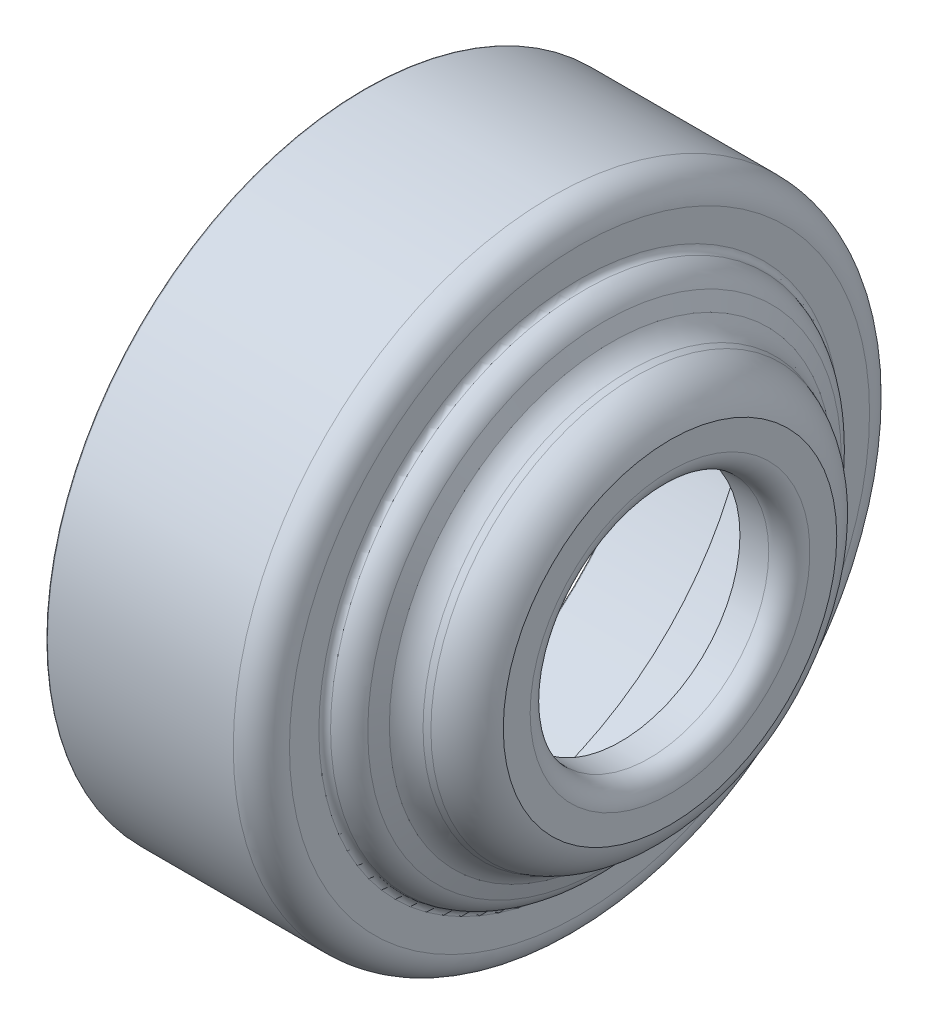
ISO-10303-21;
HEADER;
FILE_DESCRIPTION(('STEP AP214'),'2;1');
FILE_NAME('part.step','',(''),(''),'','','');
FILE_SCHEMA(('AUTOMOTIVE_DESIGN { 1 0 10303 214 1 1 1 1 }'));
ENDSEC;
DATA;
#1=APPLICATION_CONTEXT('core data for automotive mechanical design processes');
#2=APPLICATION_PROTOCOL_DEFINITION('international standard','automotive_design',2000,#1);
#3=PRODUCT_CONTEXT('',#1,'mechanical');
#4=PRODUCT('Part','Part','',(#3));
#5=PRODUCT_RELATED_PRODUCT_CATEGORY('part','',(#4));
#6=PRODUCT_DEFINITION_FORMATION('','',#4);
#7=PRODUCT_DEFINITION_CONTEXT('part definition',#1,'design');
#8=PRODUCT_DEFINITION('design','',#6,#7);
#9=PRODUCT_DEFINITION_SHAPE('','',#8);
#10=(LENGTH_UNIT() NAMED_UNIT(*) SI_UNIT(.MILLI.,.METRE.));
#11=(NAMED_UNIT(*) PLANE_ANGLE_UNIT() SI_UNIT($,.RADIAN.));
#12=(NAMED_UNIT(*) SI_UNIT($,.STERADIAN.) SOLID_ANGLE_UNIT());
#13=UNCERTAINTY_MEASURE_WITH_UNIT(LENGTH_MEASURE(1.E-05),#10,'distance_accuracy_value','');
#14=(GEOMETRIC_REPRESENTATION_CONTEXT(3) GLOBAL_UNCERTAINTY_ASSIGNED_CONTEXT((#13)) GLOBAL_UNIT_ASSIGNED_CONTEXT((#10,
#11,#12)) REPRESENTATION_CONTEXT('',''));
#15=CARTESIAN_POINT('',(0.,0.,0.));
#16=DIRECTION('',(0.,0.,1.));
#17=DIRECTION('',(1.,0.,0.));
#18=AXIS2_PLACEMENT_3D('',#15,#16,#17);
#19=CARTESIAN_POINT('',(-14.9,23.2,0.));
#20=DIRECTION('',(1.,0.,0.));
#21=DIRECTION('',(0.,0.,-1.));
#22=AXIS2_PLACEMENT_3D('',#19,#20,#21);
#23=PLANE('',#22);
#24=CARTESIAN_POINT('',(-14.9,0.,0.));
#25=DIRECTION('',(1.,0.,0.));
#26=DIRECTION('',(0.,0.,-1.));
#27=AXIS2_PLACEMENT_3D('',#24,#25,#26);
#28=CIRCLE('',#27,22.1);
#29=CARTESIAN_POINT('',(-14.9,0.,-22.1));
#30=VERTEX_POINT('',#29);
#31=EDGE_CURVE('E42',#30,#30,#28,.T.);
#32=ORIENTED_EDGE('',*,*,#31,.T.);
#33=EDGE_LOOP('',(#32));
#34=FACE_BOUND('',#33,.T.);
#35=CARTESIAN_POINT('',(-14.9,0.,0.));
#36=DIRECTION('',(1.,0.,0.));
#37=DIRECTION('',(0.,0.,-1.));
#38=AXIS2_PLACEMENT_3D('',#35,#36,#37);
#39=CIRCLE('',#38,23.1);
#40=CARTESIAN_POINT('',(-14.9,0.,-23.1));
#41=VERTEX_POINT('',#40);
#42=EDGE_CURVE('E46',#41,#41,#39,.F.);
#43=ORIENTED_EDGE('',*,*,#42,.T.);
#44=EDGE_LOOP('',(#43));
#45=FACE_BOUND('',#44,.T.);
#46=ADVANCED_FACE('F35',(#34,#45),#23,.F.);
#47=CARTESIAN_POINT('',(-28.9724854245721,0.,0.));
#48=DIRECTION('',(-1.,0.,0.));
#49=DIRECTION('',(0.,0.,1.));
#50=AXIS2_PLACEMENT_3D('',#47,#48,#49);
#51=CYLINDRICAL_SURFACE('',#50,22.);
#52=CARTESIAN_POINT('',(-14.8,0.,0.));
#53=DIRECTION('',(1.,0.,0.));
#54=DIRECTION('',(0.,0.,-1.));
#55=AXIS2_PLACEMENT_3D('',#52,#53,#54);
#56=CIRCLE('',#55,22.);
#57=CARTESIAN_POINT('',(-14.8,0.,-22.));
#58=VERTEX_POINT('',#57);
#59=EDGE_CURVE('E50',#58,#58,#56,.F.);
#60=ORIENTED_EDGE('',*,*,#59,.T.);
#61=EDGE_LOOP('',(#60));
#62=FACE_BOUND('',#61,.T.);
#63=CARTESIAN_POINT('',(-7.9,0.,0.));
#64=DIRECTION('',(-1.,0.,0.));
#65=DIRECTION('',(0.,0.,1.));
#66=AXIS2_PLACEMENT_3D('',#63,#64,#65);
#67=CIRCLE('',#66,22.);
#68=CARTESIAN_POINT('',(-7.9,0.,22.));
#69=VERTEX_POINT('',#68);
#70=EDGE_CURVE('E55',#69,#69,#67,.T.);
#71=ORIENTED_EDGE('',*,*,#70,.F.);
#72=EDGE_LOOP('',(#71));
#73=FACE_BOUND('',#72,.T.);
#74=ADVANCED_FACE('F292',(#62,#73),#51,.F.);
#75=CARTESIAN_POINT('',(-7.9,22.,0.));
#76=DIRECTION('',(1.,0.,0.));
#77=DIRECTION('',(0.,0.,-1.));
#78=AXIS2_PLACEMENT_3D('',#75,#76,#77);
#79=PLANE('',#78);
#80=CARTESIAN_POINT('',(-7.9,0.,0.));
#81=DIRECTION('',(-1.,0.,0.));
#82=DIRECTION('',(0.,0.,1.));
#83=AXIS2_PLACEMENT_3D('',#80,#81,#82);
#84=CIRCLE('',#83,21.4);
#85=CARTESIAN_POINT('',(-7.9,0.,21.4));
#86=VERTEX_POINT('',#85);
#87=EDGE_CURVE('E58',#86,#86,#84,.T.);
#88=ORIENTED_EDGE('',*,*,#87,.F.);
#89=EDGE_LOOP('',(#88));
#90=FACE_BOUND('',#89,.T.);
#91=ORIENTED_EDGE('',*,*,#70,.T.);
#92=EDGE_LOOP('',(#91));
#93=FACE_BOUND('',#92,.T.);
#94=ADVANCED_FACE('F286',(#90,#93),#79,.F.);
#95=CARTESIAN_POINT('',(-28.9724854245721,0.,0.));
#96=DIRECTION('',(-1.,0.,0.));
#97=DIRECTION('',(0.,0.,1.));
#98=AXIS2_PLACEMENT_3D('',#95,#96,#97);
#99=CYLINDRICAL_SURFACE('',#98,21.4);
#100=CARTESIAN_POINT('',(-0.899999999999998,0.,0.));
#101=DIRECTION('',(-1.,0.,0.));
#102=DIRECTION('',(0.,0.,1.));
#103=AXIS2_PLACEMENT_3D('',#100,#101,#102);
#104=CIRCLE('',#103,21.4);
#105=CARTESIAN_POINT('',(-0.899999999999998,0.,21.4));
#106=VERTEX_POINT('',#105);
#107=EDGE_CURVE('E61',#106,#106,#104,.T.);
#108=ORIENTED_EDGE('',*,*,#107,.F.);
#109=EDGE_LOOP('',(#108));
#110=FACE_BOUND('',#109,.T.);
#111=ORIENTED_EDGE('',*,*,#87,.T.);
#112=EDGE_LOOP('',(#111));
#113=FACE_BOUND('',#112,.T.);
#114=ADVANCED_FACE('F280',(#110,#113),#99,.F.);
#115=CARTESIAN_POINT('',(-0.899999999999997,0.,0.));
#116=DIRECTION('',(-1.,0.,0.));
#117=DIRECTION('',(0.,0.,1.));
#118=AXIS2_PLACEMENT_3D('',#115,#116,#117);
#119=TOROIDAL_SURFACE('',#118,20.9,0.499999999999998);
#120=CARTESIAN_POINT('',(-0.399999999999998,0.,0.));
#121=DIRECTION('',(-1.,0.,0.));
#122=DIRECTION('',(0.,0.,1.));
#123=AXIS2_PLACEMENT_3D('',#120,#121,#122);
#124=CIRCLE('',#123,20.9);
#125=CARTESIAN_POINT('',(-0.399999999999998,0.,20.9));
#126=VERTEX_POINT('',#125);
#127=EDGE_CURVE('E64',#126,#126,#124,.T.);
#128=ORIENTED_EDGE('',*,*,#127,.F.);
#129=EDGE_LOOP('',(#128));
#130=FACE_BOUND('',#129,.T.);
#131=ORIENTED_EDGE('',*,*,#107,.T.);
#132=EDGE_LOOP('',(#131));
#133=FACE_BOUND('',#132,.T.);
#134=ADVANCED_FACE('F274',(#130,#133),#119,.F.);
#135=CARTESIAN_POINT('',(-0.399999999999998,20.9,0.));
#136=DIRECTION('',(1.,0.,0.));
#137=DIRECTION('',(0.,0.,-1.));
#138=AXIS2_PLACEMENT_3D('',#135,#136,#137);
#139=PLANE('',#138);
#140=CARTESIAN_POINT('',(-0.399999999999998,0.,0.));
#141=DIRECTION('',(-1.,0.,0.));
#142=DIRECTION('',(0.,0.,1.));
#143=AXIS2_PLACEMENT_3D('',#140,#141,#142);
#144=CIRCLE('',#143,17.7);
#145=CARTESIAN_POINT('',(-0.399999999999998,0.,17.7));
#146=VERTEX_POINT('',#145);
#147=EDGE_CURVE('E67',#146,#146,#144,.T.);
#148=ORIENTED_EDGE('',*,*,#147,.F.);
#149=EDGE_LOOP('',(#148));
#150=FACE_BOUND('',#149,.T.);
#151=ORIENTED_EDGE('',*,*,#127,.T.);
#152=EDGE_LOOP('',(#151));
#153=FACE_BOUND('',#152,.T.);
#154=ADVANCED_FACE('F268',(#150,#153),#139,.F.);
#155=CARTESIAN_POINT('',(-0.0999999999999973,0.,0.));
#156=DIRECTION('',(-1.,0.,0.));
#157=DIRECTION('',(0.,0.,1.));
#158=AXIS2_PLACEMENT_3D('',#155,#156,#157);
#159=TOROIDAL_SURFACE('',#158,17.7,0.300000000000001);
#160=CARTESIAN_POINT('',(-0.0999999999999959,0.,0.));
#161=DIRECTION('',(-1.,0.,0.));
#162=DIRECTION('',(0.,0.,1.));
#163=AXIS2_PLACEMENT_3D('',#160,#161,#162);
#164=CIRCLE('',#163,17.4);
#165=CARTESIAN_POINT('',(-0.0999999999999959,0.,17.4));
#166=VERTEX_POINT('',#165);
#167=EDGE_CURVE('E70',#166,#166,#164,.T.);
#168=ORIENTED_EDGE('',*,*,#167,.F.);
#169=EDGE_LOOP('',(#168));
#170=FACE_BOUND('',#169,.T.);
#171=ORIENTED_EDGE('',*,*,#147,.T.);
#172=EDGE_LOOP('',(#171));
#173=FACE_BOUND('',#172,.T.);
#174=ADVANCED_FACE('F262',(#170,#173),#159,.T.);
#175=CARTESIAN_POINT('',(-28.9724854245721,0.,0.));
#176=DIRECTION('',(-1.,0.,0.));
#177=DIRECTION('',(0.,0.,1.));
#178=AXIS2_PLACEMENT_3D('',#175,#176,#177);
#179=CYLINDRICAL_SURFACE('',#178,17.4);
#180=CARTESIAN_POINT('',(0.600000000000003,0.,0.));
#181=DIRECTION('',(-1.,0.,0.));
#182=DIRECTION('',(0.,0.,1.));
#183=AXIS2_PLACEMENT_3D('',#180,#181,#182);
#184=CIRCLE('',#183,17.4);
#185=CARTESIAN_POINT('',(0.600000000000003,0.,17.4));
#186=VERTEX_POINT('',#185);
#187=EDGE_CURVE('E73',#186,#186,#184,.T.);
#188=ORIENTED_EDGE('',*,*,#187,.F.);
#189=EDGE_LOOP('',(#188));
#190=FACE_BOUND('',#189,.T.);
#191=ORIENTED_EDGE('',*,*,#167,.T.);
#192=EDGE_LOOP('',(#191));
#193=FACE_BOUND('',#192,.T.);
#194=ADVANCED_FACE('F256',(#190,#193),#179,.F.);
#195=CARTESIAN_POINT('',(0.601981361931688,0.,0.));
#196=DIRECTION('',(-1.,0.,0.));
#197=DIRECTION('',(0.,0.,1.));
#198=AXIS2_PLACEMENT_3D('',#195,#196,#197);
#199=TOROIDAL_SURFACE('',#198,16.4000019628995,1.);
#200=CARTESIAN_POINT('',(1.52069821576387,0.,0.));
#201=DIRECTION('',(-1.,0.,0.));
#202=DIRECTION('',(0.,0.,1.));
#203=AXIS2_PLACEMENT_3D('',#200,#201,#202);
#204=CIRCLE('',#203,16.7949188433752);
#205=CARTESIAN_POINT('',(1.52069821576387,0.,16.7949188433752));
#206=VERTEX_POINT('',#205);
#207=EDGE_CURVE('E76',#206,#206,#204,.T.);
#208=ORIENTED_EDGE('',*,*,#207,.F.);
#209=EDGE_LOOP('',(#208));
#210=FACE_BOUND('',#209,.T.);
#211=ORIENTED_EDGE('',*,*,#187,.T.);
#212=EDGE_LOOP('',(#211));
#213=FACE_BOUND('',#212,.T.);
#214=ADVANCED_FACE('F250',(#210,#213),#199,.F.);
#215=CARTESIAN_POINT('',(1.52069821576387,0.,0.));
#216=DIRECTION('',(-1.,0.,0.));
#217=DIRECTION('',(0.,0.,1.));
#218=AXIS2_PLACEMENT_3D('',#215,#216,#217);
#219=CONICAL_SURFACE('',#218,16.7949188433752,1.1693705988362);
#220=CARTESIAN_POINT('',(2.02193494607727,0.,0.));
#221=DIRECTION('',(-1.,0.,0.));
#222=DIRECTION('',(0.,0.,1.));
#223=AXIS2_PLACEMENT_3D('',#220,#221,#222);
#224=CIRCLE('',#223,15.6140791064286);
#225=CARTESIAN_POINT('',(2.02193494607727,0.,15.6140791064286));
#226=VERTEX_POINT('',#225);
#227=EDGE_CURVE('E79',#226,#226,#224,.T.);
#228=ORIENTED_EDGE('',*,*,#227,.F.);
#229=EDGE_LOOP('',(#228));
#230=FACE_BOUND('',#229,.T.);
#231=ORIENTED_EDGE('',*,*,#207,.T.);
#232=EDGE_LOOP('',(#231));
#233=FACE_BOUND('',#232,.T.);
#234=ADVANCED_FACE('F244',(#230,#233),#219,.F.);
#235=CARTESIAN_POINT('',(5.38571216961617,0.,0.));
#236=DIRECTION('',(-1.,0.,0.));
#237=DIRECTION('',(0.,0.,1.));
#238=AXIS2_PLACEMENT_3D('',#235,#236,#237);
#239=TOROIDAL_SURFACE('',#238,17.5808166444888,3.89654382154419);
#240=CARTESIAN_POINT('',(4.02426123459067,0.,0.));
#241=DIRECTION('',(-1.,0.,0.));
#242=DIRECTION('',(0.,0.,1.));
#243=AXIS2_PLACEMENT_3D('',#240,#241,#242);
#244=CIRCLE('',#243,13.92985716721);
#245=CARTESIAN_POINT('',(4.02426123459067,0.,13.92985716721));
#246=VERTEX_POINT('',#245);
#247=EDGE_CURVE('E82',#246,#246,#244,.T.);
#248=ORIENTED_EDGE('',*,*,#247,.F.);
#249=EDGE_LOOP('',(#248));
#250=FACE_BOUND('',#249,.T.);
#251=ORIENTED_EDGE('',*,*,#227,.T.);
#252=EDGE_LOOP('',(#251));
#253=FACE_BOUND('',#252,.T.);
#254=ADVANCED_FACE('F238',(#250,#253),#239,.T.);
#255=CARTESIAN_POINT('',(4.02426123459067,0.,0.));
#256=DIRECTION('',(-1.,0.,0.));
#257=DIRECTION('',(0.,0.,1.));
#258=AXIS2_PLACEMENT_3D('',#255,#256,#257);
#259=CONICAL_SURFACE('',#258,13.92985716721,0.356930263272574);
#260=CARTESIAN_POINT('',(4.46608341092177,0.,0.));
#261=DIRECTION('',(-1.,0.,0.));
#262=DIRECTION('',(0.,0.,1.));
#263=AXIS2_PLACEMENT_3D('',#260,#261,#262);
#264=CIRCLE('',#263,13.7651006918713);
#265=CARTESIAN_POINT('',(4.46608341092177,0.,13.7651006918713));
#266=VERTEX_POINT('',#265);
#267=EDGE_CURVE('E85',#266,#266,#264,.T.);
#268=ORIENTED_EDGE('',*,*,#267,.F.);
#269=EDGE_LOOP('',(#268));
#270=FACE_BOUND('',#269,.T.);
#271=ORIENTED_EDGE('',*,*,#247,.T.);
#272=EDGE_LOOP('',(#271));
#273=FACE_BOUND('',#272,.T.);
#274=ADVANCED_FACE('F232',(#270,#273),#259,.F.);
#275=CARTESIAN_POINT('',(3.65724851185547,0.,0.));
#276=DIRECTION('',(-1.,0.,0.));
#277=DIRECTION('',(0.,0.,1.));
#278=AXIS2_PLACEMENT_3D('',#275,#276,#277);
#279=TOROIDAL_SURFACE('',#278,11.2363634560668,2.6549436720374);
#280=CARTESIAN_POINT('',(6.2,0.,0.));
#281=DIRECTION('',(-1.,0.,0.));
#282=DIRECTION('',(0.,0.,1.));
#283=AXIS2_PLACEMENT_3D('',#280,#281,#282);
#284=CIRCLE('',#283,12.);
#285=CARTESIAN_POINT('',(6.2,0.,12.));
#286=VERTEX_POINT('',#285);
#287=EDGE_CURVE('E88',#286,#286,#284,.T.);
#288=ORIENTED_EDGE('',*,*,#287,.F.);
#289=EDGE_LOOP('',(#288));
#290=FACE_BOUND('',#289,.T.);
#291=ORIENTED_EDGE('',*,*,#267,.T.);
#292=EDGE_LOOP('',(#291));
#293=FACE_BOUND('',#292,.T.);
#294=ADVANCED_FACE('F226',(#290,#293),#279,.F.);
#295=CARTESIAN_POINT('',(6.2,12.,0.));
#296=DIRECTION('',(1.,0.,0.));
#297=DIRECTION('',(0.,0.,-1.));
#298=AXIS2_PLACEMENT_3D('',#295,#296,#297);
#299=PLANE('',#298);
#300=CARTESIAN_POINT('',(6.2,0.,0.));
#301=DIRECTION('',(-1.,0.,0.));
#302=DIRECTION('',(0.,0.,1.));
#303=AXIS2_PLACEMENT_3D('',#300,#301,#302);
#304=CIRCLE('',#303,9.89999999999999);
#305=CARTESIAN_POINT('',(6.2,0.,9.89999999999999));
#306=VERTEX_POINT('',#305);
#307=EDGE_CURVE('E91',#306,#306,#304,.T.);
#308=ORIENTED_EDGE('',*,*,#307,.F.);
#309=EDGE_LOOP('',(#308));
#310=FACE_BOUND('',#309,.T.);
#311=ORIENTED_EDGE('',*,*,#287,.T.);
#312=EDGE_LOOP('',(#311));
#313=FACE_BOUND('',#312,.T.);
#314=ADVANCED_FACE('F220',(#310,#313),#299,.F.);
#315=CARTESIAN_POINT('',(5.7,0.,0.));
#316=DIRECTION('',(-1.,0.,0.));
#317=DIRECTION('',(0.,0.,1.));
#318=AXIS2_PLACEMENT_3D('',#315,#316,#317);
#319=TOROIDAL_SURFACE('',#318,9.89999999999999,0.499999999999999);
#320=CARTESIAN_POINT('',(5.7,0.,0.));
#321=DIRECTION('',(-1.,0.,0.));
#322=DIRECTION('',(0.,0.,1.));
#323=AXIS2_PLACEMENT_3D('',#320,#321,#322);
#324=CIRCLE('',#323,9.39999999999999);
#325=CARTESIAN_POINT('',(5.7,0.,9.39999999999999));
#326=VERTEX_POINT('',#325);
#327=EDGE_CURVE('E94',#326,#326,#324,.T.);
#328=ORIENTED_EDGE('',*,*,#327,.F.);
#329=EDGE_LOOP('',(#328));
#330=FACE_BOUND('',#329,.T.);
#331=ORIENTED_EDGE('',*,*,#307,.T.);
#332=EDGE_LOOP('',(#331));
#333=FACE_BOUND('',#332,.T.);
#334=ADVANCED_FACE('F214',(#330,#333),#319,.F.);
#335=CARTESIAN_POINT('',(-28.9724854245721,0.,0.));
#336=DIRECTION('',(-1.,0.,0.));
#337=DIRECTION('',(0.,0.,1.));
#338=AXIS2_PLACEMENT_3D('',#335,#336,#337);
#339=CYLINDRICAL_SURFACE('',#338,9.39999999999999);
#340=CARTESIAN_POINT('',(3.8,0.,0.));
#341=DIRECTION('',(-1.,0.,0.));
#342=DIRECTION('',(0.,0.,1.));
#343=AXIS2_PLACEMENT_3D('',#340,#341,#342);
#344=CIRCLE('',#343,9.39999999999999);
#345=CARTESIAN_POINT('',(3.8,0.,9.39999999999999));
#346=VERTEX_POINT('',#345);
#347=EDGE_CURVE('E97',#346,#346,#344,.T.);
#348=ORIENTED_EDGE('',*,*,#347,.F.);
#349=EDGE_LOOP('',(#348));
#350=FACE_BOUND('',#349,.T.);
#351=ORIENTED_EDGE('',*,*,#327,.T.);
#352=EDGE_LOOP('',(#351));
#353=FACE_BOUND('',#352,.T.);
#354=ADVANCED_FACE('F208',(#350,#353),#339,.T.);
#355=CARTESIAN_POINT('',(3.8,9.39999999999999,0.));
#356=DIRECTION('',(1.,0.,0.));
#357=DIRECTION('',(0.,0.,-1.));
#358=AXIS2_PLACEMENT_3D('',#355,#356,#357);
#359=PLANE('',#358);
#360=CARTESIAN_POINT('',(3.8,0.,0.));
#361=DIRECTION('',(-1.,0.,0.));
#362=DIRECTION('',(0.,0.,1.));
#363=AXIS2_PLACEMENT_3D('',#360,#361,#362);
#364=CIRCLE('',#363,8.69999999999999);
#365=CARTESIAN_POINT('',(3.8,0.,8.69999999999999));
#366=VERTEX_POINT('',#365);
#367=EDGE_CURVE('E100',#366,#366,#364,.T.);
#368=ORIENTED_EDGE('',*,*,#367,.F.);
#369=EDGE_LOOP('',(#368));
#370=FACE_BOUND('',#369,.T.);
#371=ORIENTED_EDGE('',*,*,#347,.T.);
#372=EDGE_LOOP('',(#371));
#373=FACE_BOUND('',#372,.T.);
#374=ADVANCED_FACE('F202',(#370,#373),#359,.F.);
#375=CARTESIAN_POINT('',(-28.9724854245721,0.,0.));
#376=DIRECTION('',(-1.,0.,0.));
#377=DIRECTION('',(0.,0.,1.));
#378=AXIS2_PLACEMENT_3D('',#375,#376,#377);
#379=CYLINDRICAL_SURFACE('',#378,8.69999999999999);
#380=CARTESIAN_POINT('',(5.9,0.,0.));
#381=DIRECTION('',(-1.,0.,0.));
#382=DIRECTION('',(0.,0.,1.));
#383=AXIS2_PLACEMENT_3D('',#380,#381,#382);
#384=CIRCLE('',#383,8.69999999999999);
#385=CARTESIAN_POINT('',(5.9,0.,8.69999999999999));
#386=VERTEX_POINT('',#385);
#387=EDGE_CURVE('E103',#386,#386,#384,.T.);
#388=ORIENTED_EDGE('',*,*,#387,.F.);
#389=EDGE_LOOP('',(#388));
#390=FACE_BOUND('',#389,.T.);
#391=ORIENTED_EDGE('',*,*,#367,.T.);
#392=EDGE_LOOP('',(#391));
#393=FACE_BOUND('',#392,.T.);
#394=ADVANCED_FACE('F196',(#390,#393),#379,.F.);
#395=CARTESIAN_POINT('',(5.9,0.,0.));
#396=DIRECTION('',(-1.,0.,0.));
#397=DIRECTION('',(0.,0.,1.));
#398=AXIS2_PLACEMENT_3D('',#395,#396,#397);
#399=TOROIDAL_SURFACE('',#398,10.2,1.5);
#400=CARTESIAN_POINT('',(7.4,0.,0.));
#401=DIRECTION('',(-1.,0.,0.));
#402=DIRECTION('',(0.,0.,1.));
#403=AXIS2_PLACEMENT_3D('',#400,#401,#402);
#404=CIRCLE('',#403,10.2);
#405=CARTESIAN_POINT('',(7.4,0.,10.2));
#406=VERTEX_POINT('',#405);
#407=EDGE_CURVE('E106',#406,#406,#404,.T.);
#408=ORIENTED_EDGE('',*,*,#407,.F.);
#409=EDGE_LOOP('',(#408));
#410=FACE_BOUND('',#409,.T.);
#411=ORIENTED_EDGE('',*,*,#387,.T.);
#412=EDGE_LOOP('',(#411));
#413=FACE_BOUND('',#412,.T.);
#414=ADVANCED_FACE('F190',(#410,#413),#399,.T.);
#415=CARTESIAN_POINT('',(7.4,12.1596196570062,0.));
#416=DIRECTION('',(-1.,0.,0.));
#417=DIRECTION('',(0.,0.,1.));
#418=AXIS2_PLACEMENT_3D('',#415,#416,#417);
#419=PLANE('',#418);
#420=CARTESIAN_POINT('',(7.4,0.,0.));
#421=DIRECTION('',(-1.,0.,0.));
#422=DIRECTION('',(0.,0.,1.));
#423=AXIS2_PLACEMENT_3D('',#420,#421,#422);
#424=CIRCLE('',#423,12.1596196570062);
#425=CARTESIAN_POINT('',(7.4,0.,12.1596196570062));
#426=VERTEX_POINT('',#425);
#427=EDGE_CURVE('E109',#426,#426,#424,.T.);
#428=ORIENTED_EDGE('',*,*,#427,.F.);
#429=EDGE_LOOP('',(#428));
#430=FACE_BOUND('',#429,.T.);
#431=ORIENTED_EDGE('',*,*,#407,.T.);
#432=EDGE_LOOP('',(#431));
#433=FACE_BOUND('',#432,.T.);
#434=ADVANCED_FACE('F184',(#430,#433),#419,.F.);
#435=CARTESIAN_POINT('',(3.65724851185547,0.,0.));
#436=DIRECTION('',(-1.,0.,0.));
#437=DIRECTION('',(0.,0.,1.));
#438=AXIS2_PLACEMENT_3D('',#435,#436,#437);
#439=TOROIDAL_SURFACE('',#438,11.2363634560668,3.8549436720374);
#440=CARTESIAN_POINT('',(4.86121133594503,0.,0.));
#441=DIRECTION('',(-1.,0.,0.));
#442=DIRECTION('',(0.,0.,1.));
#443=AXIS2_PLACEMENT_3D('',#440,#441,#442);
#444=CIRCLE('',#443,14.8984754468164);
#445=CARTESIAN_POINT('',(4.86121133594503,0.,14.8984754468164));
#446=VERTEX_POINT('',#445);
#447=EDGE_CURVE('E112',#446,#446,#444,.T.);
#448=ORIENTED_EDGE('',*,*,#447,.F.);
#449=EDGE_LOOP('',(#448));
#450=FACE_BOUND('',#449,.T.);
#451=ORIENTED_EDGE('',*,*,#427,.T.);
#452=EDGE_LOOP('',(#451));
#453=FACE_BOUND('',#452,.T.);
#454=ADVANCED_FACE('F178',(#450,#453),#439,.T.);
#455=CARTESIAN_POINT('',(4.86121133594503,0.,0.));
#456=DIRECTION('',(-1.,0.,0.));
#457=DIRECTION('',(0.,0.,1.));
#458=AXIS2_PLACEMENT_3D('',#455,#456,#457);
#459=CONICAL_SURFACE('',#458,14.8984754468164,0.356930263272583);
#460=CARTESIAN_POINT('',(4.44354077996562,0.,0.));
#461=DIRECTION('',(-1.,0.,0.));
#462=DIRECTION('',(0.,0.,1.));
#463=AXIS2_PLACEMENT_3D('',#460,#461,#462);
#464=CIRCLE('',#463,15.0542257290393);
#465=CARTESIAN_POINT('',(4.44354077996562,0.,15.0542257290393));
#466=VERTEX_POINT('',#465);
#467=EDGE_CURVE('E115',#466,#466,#464,.T.);
#468=ORIENTED_EDGE('',*,*,#467,.F.);
#469=EDGE_LOOP('',(#468));
#470=FACE_BOUND('',#469,.T.);
#471=ORIENTED_EDGE('',*,*,#447,.T.);
#472=EDGE_LOOP('',(#471));
#473=FACE_BOUND('',#472,.T.);
#474=ADVANCED_FACE('F172',(#470,#473),#459,.T.);
#475=CARTESIAN_POINT('',(5.38571216961617,0.,0.));
#476=DIRECTION('',(-1.,0.,0.));
#477=DIRECTION('',(0.,0.,1.));
#478=AXIS2_PLACEMENT_3D('',#475,#476,#477);
#479=TOROIDAL_SURFACE('',#478,17.5808166444888,2.69654382154419);
#480=CARTESIAN_POINT('',(3.09380938830858,0.,0.));
#481=DIRECTION('',(-1.,0.,0.));
#482=DIRECTION('',(0.,0.,1.));
#483=AXIS2_PLACEMENT_3D('',#480,#481,#482);
#484=CIRCLE('',#483,16.160066764129);
#485=CARTESIAN_POINT('',(3.09380938830858,0.,16.160066764129));
#486=VERTEX_POINT('',#485);
#487=EDGE_CURVE('E118',#486,#486,#484,.T.);
#488=ORIENTED_EDGE('',*,*,#487,.F.);
#489=EDGE_LOOP('',(#488));
#490=FACE_BOUND('',#489,.T.);
#491=ORIENTED_EDGE('',*,*,#467,.T.);
#492=EDGE_LOOP('',(#491));
#493=FACE_BOUND('',#492,.T.);
#494=ADVANCED_FACE('F166',(#490,#493),#479,.F.);
#495=CARTESIAN_POINT('',(3.09380938830858,0.,0.));
#496=DIRECTION('',(-1.,0.,0.));
#497=DIRECTION('',(0.,0.,1.));
#498=AXIS2_PLACEMENT_3D('',#495,#496,#497);
#499=CONICAL_SURFACE('',#498,16.160066764129,1.1693705988362);
#500=CARTESIAN_POINT('',(2.62444461160248,0.,0.));
#501=DIRECTION('',(-1.,0.,0.));
#502=DIRECTION('',(0.,0.,1.));
#503=AXIS2_PLACEMENT_3D('',#500,#501,#502);
#504=CIRCLE('',#503,17.2658208837663);
#505=CARTESIAN_POINT('',(2.62444461160248,0.,17.2658208837663));
#506=VERTEX_POINT('',#505);
#507=EDGE_CURVE('E121',#506,#506,#504,.T.);
#508=ORIENTED_EDGE('',*,*,#507,.F.);
#509=EDGE_LOOP('',(#508));
#510=FACE_BOUND('',#509,.T.);
#511=ORIENTED_EDGE('',*,*,#487,.T.);
#512=EDGE_LOOP('',(#511));
#513=FACE_BOUND('',#512,.T.);
#514=ADVANCED_FACE('F160',(#510,#513),#499,.T.);
#515=CARTESIAN_POINT('',(0.601981361931688,0.,0.));
#516=DIRECTION('',(-1.,0.,0.));
#517=DIRECTION('',(0.,0.,1.));
#518=AXIS2_PLACEMENT_3D('',#515,#516,#517);
#519=TOROIDAL_SURFACE('',#518,16.4000019628995,2.2);
#520=CARTESIAN_POINT('',(1.17073728924661,0.,0.));
#521=DIRECTION('',(-1.,0.,0.));
#522=DIRECTION('',(0.,0.,1.));
#523=AXIS2_PLACEMENT_3D('',#520,#521,#522);
#524=CIRCLE('',#523,18.5252117631649);
#525=CARTESIAN_POINT('',(1.17073728924661,0.,18.5252117631649));
#526=VERTEX_POINT('',#525);
#527=EDGE_CURVE('E124',#526,#526,#524,.T.);
#528=ORIENTED_EDGE('',*,*,#527,.F.);
#529=EDGE_LOOP('',(#528));
#530=FACE_BOUND('',#529,.T.);
#531=ORIENTED_EDGE('',*,*,#507,.T.);
#532=EDGE_LOOP('',(#531));
#533=FACE_BOUND('',#532,.T.);
#534=ADVANCED_FACE('F154',(#530,#533),#519,.T.);
#535=CARTESIAN_POINT('',(1.3,0.,0.));
#536=DIRECTION('',(-1.,0.,0.));
#537=DIRECTION('',(0.,0.,1.));
#538=AXIS2_PLACEMENT_3D('',#535,#536,#537);
#539=TOROIDAL_SURFACE('',#538,19.0082139904979,0.5);
#540=CARTESIAN_POINT('',(0.800000000000002,0.,0.));
#541=DIRECTION('',(-1.,0.,0.));
#542=DIRECTION('',(0.,0.,1.));
#543=AXIS2_PLACEMENT_3D('',#540,#541,#542);
#544=CIRCLE('',#543,19.0082139904979);
#545=CARTESIAN_POINT('',(0.800000000000002,0.,19.0082139904979));
#546=VERTEX_POINT('',#545);
#547=EDGE_CURVE('E127',#546,#546,#544,.T.);
#548=ORIENTED_EDGE('',*,*,#547,.F.);
#549=EDGE_LOOP('',(#548));
#550=FACE_BOUND('',#549,.T.);
#551=ORIENTED_EDGE('',*,*,#527,.T.);
#552=EDGE_LOOP('',(#551));
#553=FACE_BOUND('',#552,.T.);
#554=ADVANCED_FACE('F148',(#550,#553),#539,.F.);
#555=CARTESIAN_POINT('',(0.800000000000001,21.15,0.));
#556=DIRECTION('',(-1.,0.,0.));
#557=DIRECTION('',(0.,0.,1.));
#558=AXIS2_PLACEMENT_3D('',#555,#556,#557);
#559=PLANE('',#558);
#560=CARTESIAN_POINT('',(0.799999999999999,0.,0.));
#561=DIRECTION('',(-1.,0.,0.));
#562=DIRECTION('',(0.,0.,1.));
#563=AXIS2_PLACEMENT_3D('',#560,#561,#562);
#564=CIRCLE('',#563,21.15);
#565=CARTESIAN_POINT('',(0.799999999999999,0.,21.15));
#566=VERTEX_POINT('',#565);
#567=EDGE_CURVE('E130',#566,#566,#564,.T.);
#568=ORIENTED_EDGE('',*,*,#567,.F.);
#569=EDGE_LOOP('',(#568));
#570=FACE_BOUND('',#569,.T.);
#571=ORIENTED_EDGE('',*,*,#547,.T.);
#572=EDGE_LOOP('',(#571));
#573=FACE_BOUND('',#572,.T.);
#574=ADVANCED_FACE('F142',(#570,#573),#559,.F.);
#575=CARTESIAN_POINT('',(-1.25,0.,0.));
#576=DIRECTION('',(-1.,0.,0.));
#577=DIRECTION('',(0.,0.,1.));
#578=AXIS2_PLACEMENT_3D('',#575,#576,#577);
#579=TOROIDAL_SURFACE('',#578,21.15,2.05);
#580=CARTESIAN_POINT('',(-1.25000000000001,0.,0.));
#581=DIRECTION('',(-1.,0.,0.));
#582=DIRECTION('',(0.,0.,1.));
#583=AXIS2_PLACEMENT_3D('',#580,#581,#582);
#584=CIRCLE('',#583,23.2);
#585=CARTESIAN_POINT('',(-1.25000000000001,0.,23.2));
#586=VERTEX_POINT('',#585);
#587=EDGE_CURVE('E133',#586,#586,#584,.T.);
#588=ORIENTED_EDGE('',*,*,#587,.F.);
#589=EDGE_LOOP('',(#588));
#590=FACE_BOUND('',#589,.T.);
#591=ORIENTED_EDGE('',*,*,#567,.T.);
#592=EDGE_LOOP('',(#591));
#593=FACE_BOUND('',#592,.T.);
#594=ADVANCED_FACE('F139',(#590,#593),#579,.T.);
#595=CARTESIAN_POINT('',(-28.9724854245721,0.,0.));
#596=DIRECTION('',(-1.,0.,0.));
#597=DIRECTION('',(0.,0.,1.));
#598=AXIS2_PLACEMENT_3D('',#595,#596,#597);
#599=CYLINDRICAL_SURFACE('',#598,23.2);
#600=CARTESIAN_POINT('',(-14.8,0.,0.));
#601=DIRECTION('',(1.,0.,0.));
#602=DIRECTION('',(0.,0.,-1.));
#603=AXIS2_PLACEMENT_3D('',#600,#601,#602);
#604=CIRCLE('',#603,23.2);
#605=CARTESIAN_POINT('',(-14.8,0.,-23.2));
#606=VERTEX_POINT('',#605);
#607=EDGE_CURVE('E10',#606,#606,#604,.T.);
#608=ORIENTED_EDGE('',*,*,#607,.T.);
#609=EDGE_LOOP('',(#608));
#610=FACE_BOUND('',#609,.T.);
#611=ORIENTED_EDGE('',*,*,#587,.T.);
#612=EDGE_LOOP('',(#611));
#613=FACE_BOUND('',#612,.T.);
#614=ADVANCED_FACE('F137',(#610,#613),#599,.T.);
#615=CARTESIAN_POINT('',(-14.8,0.,0.));
#616=DIRECTION('',(1.,0.,0.));
#617=DIRECTION('',(0.,0.,-1.));
#618=AXIS2_PLACEMENT_3D('',#615,#616,#617);
#619=TOROIDAL_SURFACE('',#618,22.1,0.1);
#620=ORIENTED_EDGE('',*,*,#31,.F.);
#621=EDGE_LOOP('',(#620));
#622=FACE_BOUND('',#621,.T.);
#623=ORIENTED_EDGE('',*,*,#59,.F.);
#624=EDGE_LOOP('',(#623));
#625=FACE_BOUND('',#624,.T.);
#626=ADVANCED_FACE('F303',(#622,#625),#619,.T.);
#627=CARTESIAN_POINT('',(-14.8,0.,0.));
#628=DIRECTION('',(1.,0.,0.));
#629=DIRECTION('',(0.,0.,-1.));
#630=AXIS2_PLACEMENT_3D('',#627,#628,#629);
#631=TOROIDAL_SURFACE('',#630,23.1,0.1);
#632=ORIENTED_EDGE('',*,*,#607,.F.);
#633=EDGE_LOOP('',(#632));
#634=FACE_BOUND('',#633,.T.);
#635=ORIENTED_EDGE('',*,*,#42,.F.);
#636=EDGE_LOOP('',(#635));
#637=FACE_BOUND('',#636,.T.);
#638=ADVANCED_FACE('F37',(#634,#637),#631,.T.);
#639=CLOSED_SHELL('',(#46,#74,#94,#114,#134,#154,#174,#194,#214,#234,#254,#274,#294,#314,#334,
#354,#374,#394,#414,#434,#454,#474,#494,#514,#534,#554,#574,#594,#614,#626,#638));
#640=MANIFOLD_SOLID_BREP('B2',#639);
#641=ADVANCED_BREP_SHAPE_REPRESENTATION('',(#18,#640),#14);
#642=SHAPE_DEFINITION_REPRESENTATION(#9,#641);
ENDSEC;
END-ISO-10303-21;
